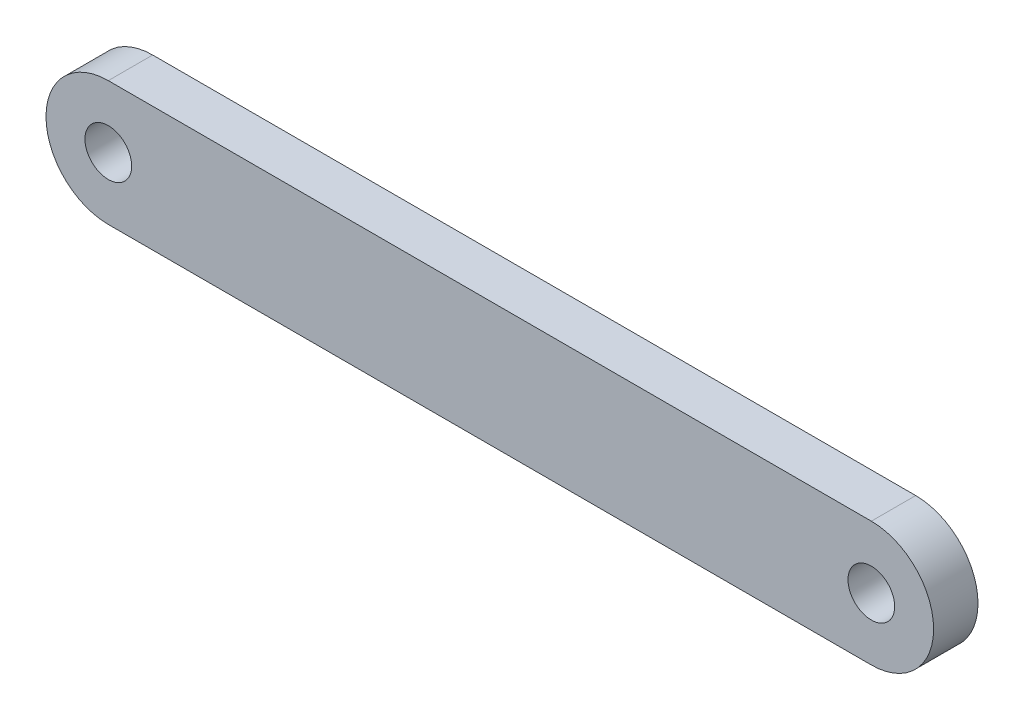
ISO-10303-21;
HEADER;
FILE_DESCRIPTION(('STEP AP214'),'2;1');
FILE_NAME('part.step','',(''),(''),'','','');
FILE_SCHEMA(('AUTOMOTIVE_DESIGN { 1 0 10303 214 1 1 1 1 }'));
ENDSEC;
DATA;
#1=APPLICATION_CONTEXT('core data for automotive mechanical design processes');
#2=APPLICATION_PROTOCOL_DEFINITION('international standard','automotive_design',2000,#1);
#3=PRODUCT_CONTEXT('',#1,'mechanical');
#4=PRODUCT('Part','Part','',(#3));
#5=PRODUCT_RELATED_PRODUCT_CATEGORY('part','',(#4));
#6=PRODUCT_DEFINITION_FORMATION('','',#4);
#7=PRODUCT_DEFINITION_CONTEXT('part definition',#1,'design');
#8=PRODUCT_DEFINITION('design','',#6,#7);
#9=PRODUCT_DEFINITION_SHAPE('','',#8);
#10=(LENGTH_UNIT() NAMED_UNIT(*) SI_UNIT(.MILLI.,.METRE.));
#11=(NAMED_UNIT(*) PLANE_ANGLE_UNIT() SI_UNIT($,.RADIAN.));
#12=(NAMED_UNIT(*) SI_UNIT($,.STERADIAN.) SOLID_ANGLE_UNIT());
#13=UNCERTAINTY_MEASURE_WITH_UNIT(LENGTH_MEASURE(1.E-05),#10,'distance_accuracy_value','');
#14=(GEOMETRIC_REPRESENTATION_CONTEXT(3) GLOBAL_UNCERTAINTY_ASSIGNED_CONTEXT((#13)) GLOBAL_UNIT_ASSIGNED_CONTEXT((#10,
#11,#12)) REPRESENTATION_CONTEXT('',''));
#15=CARTESIAN_POINT('',(0.,0.,0.));
#16=DIRECTION('',(0.,0.,1.));
#17=DIRECTION('',(1.,0.,0.));
#18=AXIS2_PLACEMENT_3D('',#15,#16,#17);
#19=CARTESIAN_POINT('',(0.,0.,2.85));
#20=DIRECTION('',(0.,0.,1.));
#21=DIRECTION('',(1.,0.,0.));
#22=AXIS2_PLACEMENT_3D('',#19,#20,#21);
#23=PLANE('',#22);
#24=DIRECTION('',(-1.,0.,0.));
#25=VECTOR('',#24,1.);
#26=CARTESIAN_POINT('',(-28.5,4.,2.85));
#27=LINE('',#26,#25);
#28=CARTESIAN_POINT('',(24.5,4.,2.85));
#29=VERTEX_POINT('',#28);
#30=CARTESIAN_POINT('',(-24.5,4.,2.85));
#31=VERTEX_POINT('',#30);
#32=EDGE_CURVE('E78',#29,#31,#27,.T.);
#33=ORIENTED_EDGE('',*,*,#32,.T.);
#34=CARTESIAN_POINT('',(-24.5,0.,2.85));
#35=DIRECTION('',(0.,0.,1.));
#36=DIRECTION('',(-1.,0.,0.));
#37=AXIS2_PLACEMENT_3D('',#34,#35,#36);
#38=CIRCLE('',#37,4.);
#39=CARTESIAN_POINT('',(-24.5,-4.,2.85));
#40=VERTEX_POINT('',#39);
#41=EDGE_CURVE('E75',#31,#40,#38,.T.);
#42=ORIENTED_EDGE('',*,*,#41,.T.);
#43=DIRECTION('',(1.,0.,0.));
#44=VECTOR('',#43,1.);
#45=CARTESIAN_POINT('',(-28.5,-4.,2.85));
#46=LINE('',#45,#44);
#47=CARTESIAN_POINT('',(24.5,-4.,2.85));
#48=VERTEX_POINT('',#47);
#49=EDGE_CURVE('E60',#40,#48,#46,.T.);
#50=ORIENTED_EDGE('',*,*,#49,.T.);
#51=CARTESIAN_POINT('',(24.5,0.,2.85));
#52=DIRECTION('',(0.,0.,-1.));
#53=DIRECTION('',(1.,0.,0.));
#54=AXIS2_PLACEMENT_3D('',#51,#52,#53);
#55=CIRCLE('',#54,4.);
#56=EDGE_CURVE('E103',#29,#48,#55,.T.);
#57=ORIENTED_EDGE('',*,*,#56,.F.);
#58=EDGE_LOOP('',(#33,#42,#50,#57));
#59=FACE_BOUND('',#58,.T.);
#60=CARTESIAN_POINT('',(24.5,0.,2.85));
#61=DIRECTION('',(0.,0.,1.));
#62=DIRECTION('',(1.,0.,0.));
#63=AXIS2_PLACEMENT_3D('',#60,#61,#62);
#64=CIRCLE('',#63,1.5);
#65=CARTESIAN_POINT('',(26.,0.,2.85));
#66=VERTEX_POINT('',#65);
#67=EDGE_CURVE('E87',#66,#66,#64,.T.);
#68=ORIENTED_EDGE('',*,*,#67,.F.);
#69=EDGE_LOOP('',(#68));
#70=FACE_BOUND('',#69,.T.);
#71=CARTESIAN_POINT('',(-24.5,0.,2.85));
#72=DIRECTION('',(0.,0.,-1.));
#73=DIRECTION('',(-1.,0.,0.));
#74=AXIS2_PLACEMENT_3D('',#71,#72,#73);
#75=CIRCLE('',#74,1.5);
#76=CARTESIAN_POINT('',(-26.,0.,2.85));
#77=VERTEX_POINT('',#76);
#78=EDGE_CURVE('E117',#77,#77,#75,.T.);
#79=ORIENTED_EDGE('',*,*,#78,.T.);
#80=EDGE_LOOP('',(#79));
#81=FACE_BOUND('',#80,.T.);
#82=ADVANCED_FACE('F32',(#59,#70,#81),#23,.T.);
#83=CARTESIAN_POINT('',(0.,0.,0.));
#84=DIRECTION('',(0.,0.,1.));
#85=DIRECTION('',(1.,0.,0.));
#86=AXIS2_PLACEMENT_3D('',#83,#84,#85);
#87=PLANE('',#86);
#88=CARTESIAN_POINT('',(-24.5,0.,0.));
#89=DIRECTION('',(0.,0.,1.));
#90=DIRECTION('',(1.,0.,0.));
#91=AXIS2_PLACEMENT_3D('',#88,#89,#90);
#92=CIRCLE('',#91,4.);
#93=CARTESIAN_POINT('',(-24.5,4.,0.));
#94=VERTEX_POINT('',#93);
#95=CARTESIAN_POINT('',(-24.5,-4.,0.));
#96=VERTEX_POINT('',#95);
#97=EDGE_CURVE('E11',#94,#96,#92,.T.);
#98=ORIENTED_EDGE('',*,*,#97,.F.);
#99=DIRECTION('',(-1.,0.,0.));
#100=VECTOR('',#99,1.);
#101=CARTESIAN_POINT('',(-28.5,4.,0.));
#102=LINE('',#101,#100);
#103=CARTESIAN_POINT('',(24.5,4.,0.));
#104=VERTEX_POINT('',#103);
#105=EDGE_CURVE('E97',#104,#94,#102,.T.);
#106=ORIENTED_EDGE('',*,*,#105,.F.);
#107=CARTESIAN_POINT('',(24.5,0.,0.));
#108=DIRECTION('',(0.,0.,1.));
#109=DIRECTION('',(1.,0.,0.));
#110=AXIS2_PLACEMENT_3D('',#107,#108,#109);
#111=CIRCLE('',#110,4.);
#112=CARTESIAN_POINT('',(24.5,-4.,0.));
#113=VERTEX_POINT('',#112);
#114=EDGE_CURVE('E41',#104,#113,#111,.F.);
#115=ORIENTED_EDGE('',*,*,#114,.T.);
#116=DIRECTION('',(1.,0.,0.));
#117=VECTOR('',#116,1.);
#118=CARTESIAN_POINT('',(-28.5,-4.,0.));
#119=LINE('',#118,#117);
#120=EDGE_CURVE('E93',#96,#113,#119,.T.);
#121=ORIENTED_EDGE('',*,*,#120,.F.);
#122=EDGE_LOOP('',(#98,#106,#115,#121));
#123=FACE_BOUND('',#122,.T.);
#124=CARTESIAN_POINT('',(24.5,0.,0.));
#125=DIRECTION('',(0.,0.,1.));
#126=DIRECTION('',(1.,0.,0.));
#127=AXIS2_PLACEMENT_3D('',#124,#125,#126);
#128=CIRCLE('',#127,1.5);
#129=CARTESIAN_POINT('',(26.,0.,0.));
#130=VERTEX_POINT('',#129);
#131=EDGE_CURVE('E111',#130,#130,#128,.T.);
#132=ORIENTED_EDGE('',*,*,#131,.T.);
#133=EDGE_LOOP('',(#132));
#134=FACE_BOUND('',#133,.T.);
#135=CARTESIAN_POINT('',(-24.5,0.,0.));
#136=DIRECTION('',(0.,0.,-1.));
#137=DIRECTION('',(-1.,0.,0.));
#138=AXIS2_PLACEMENT_3D('',#135,#136,#137);
#139=CIRCLE('',#138,1.5);
#140=CARTESIAN_POINT('',(-26.,0.,0.));
#141=VERTEX_POINT('',#140);
#142=EDGE_CURVE('E81',#141,#141,#139,.T.);
#143=ORIENTED_EDGE('',*,*,#142,.F.);
#144=EDGE_LOOP('',(#143));
#145=FACE_BOUND('',#144,.T.);
#146=ADVANCED_FACE('F105',(#123,#134,#145),#87,.F.);
#147=CARTESIAN_POINT('',(-28.5,-4.,2.85));
#148=DIRECTION('',(0.,1.,0.));
#149=DIRECTION('',(0.,0.,1.));
#150=AXIS2_PLACEMENT_3D('',#147,#148,#149);
#151=PLANE('',#150);
#152=DIRECTION('',(0.,0.,1.));
#153=VECTOR('',#152,1.);
#154=CARTESIAN_POINT('',(-24.5,-4.,0.));
#155=LINE('',#154,#153);
#156=EDGE_CURVE('E83',#96,#40,#155,.T.);
#157=ORIENTED_EDGE('',*,*,#156,.F.);
#158=ORIENTED_EDGE('',*,*,#120,.T.);
#159=DIRECTION('',(0.,0.,1.));
#160=VECTOR('',#159,1.);
#161=CARTESIAN_POINT('',(24.5,-4.,0.));
#162=LINE('',#161,#160);
#163=EDGE_CURVE('E91',#113,#48,#162,.T.);
#164=ORIENTED_EDGE('',*,*,#163,.T.);
#165=ORIENTED_EDGE('',*,*,#49,.F.);
#166=EDGE_LOOP('',(#157,#158,#164,#165));
#167=FACE_BOUND('',#166,.T.);
#168=ADVANCED_FACE('F90',(#167),#151,.F.);
#169=CARTESIAN_POINT('',(-28.5,4.,2.85));
#170=DIRECTION('',(0.,-1.,0.));
#171=DIRECTION('',(0.,0.,-1.));
#172=AXIS2_PLACEMENT_3D('',#169,#170,#171);
#173=PLANE('',#172);
#174=ORIENTED_EDGE('',*,*,#105,.T.);
#175=DIRECTION('',(0.,0.,1.));
#176=VECTOR('',#175,1.);
#177=CARTESIAN_POINT('',(-24.5,4.,0.));
#178=LINE('',#177,#176);
#179=EDGE_CURVE('E80',#94,#31,#178,.T.);
#180=ORIENTED_EDGE('',*,*,#179,.T.);
#181=ORIENTED_EDGE('',*,*,#32,.F.);
#182=DIRECTION('',(0.,0.,1.));
#183=VECTOR('',#182,1.);
#184=CARTESIAN_POINT('',(24.5,4.,0.));
#185=LINE('',#184,#183);
#186=EDGE_CURVE('E100',#104,#29,#185,.T.);
#187=ORIENTED_EDGE('',*,*,#186,.F.);
#188=EDGE_LOOP('',(#174,#180,#181,#187));
#189=FACE_BOUND('',#188,.T.);
#190=ADVANCED_FACE('F34',(#189),#173,.F.);
#191=CARTESIAN_POINT('',(24.5,0.,0.));
#192=DIRECTION('',(0.,0.,1.));
#193=DIRECTION('',(1.,0.,0.));
#194=AXIS2_PLACEMENT_3D('',#191,#192,#193);
#195=CYLINDRICAL_SURFACE('',#194,4.);
#196=ORIENTED_EDGE('',*,*,#56,.T.);
#197=ORIENTED_EDGE('',*,*,#163,.F.);
#198=ORIENTED_EDGE('',*,*,#114,.F.);
#199=ORIENTED_EDGE('',*,*,#186,.T.);
#200=EDGE_LOOP('',(#196,#197,#198,#199));
#201=FACE_BOUND('',#200,.T.);
#202=ADVANCED_FACE('F102',(#201),#195,.T.);
#203=CARTESIAN_POINT('',(24.5,0.,0.));
#204=DIRECTION('',(0.,0.,1.));
#205=DIRECTION('',(1.,0.,0.));
#206=AXIS2_PLACEMENT_3D('',#203,#204,#205);
#207=CYLINDRICAL_SURFACE('',#206,1.5);
#208=ORIENTED_EDGE('',*,*,#131,.F.);
#209=EDGE_LOOP('',(#208));
#210=FACE_BOUND('',#209,.T.);
#211=ORIENTED_EDGE('',*,*,#67,.T.);
#212=EDGE_LOOP('',(#211));
#213=FACE_BOUND('',#212,.T.);
#214=ADVANCED_FACE('F136',(#210,#213),#207,.F.);
#215=CARTESIAN_POINT('',(-24.5,0.,0.));
#216=DIRECTION('',(0.,0.,1.));
#217=DIRECTION('',(1.,0.,0.));
#218=AXIS2_PLACEMENT_3D('',#215,#216,#217);
#219=CYLINDRICAL_SURFACE('',#218,4.);
#220=ORIENTED_EDGE('',*,*,#179,.F.);
#221=ORIENTED_EDGE('',*,*,#97,.T.);
#222=ORIENTED_EDGE('',*,*,#156,.T.);
#223=ORIENTED_EDGE('',*,*,#41,.F.);
#224=EDGE_LOOP('',(#220,#221,#222,#223));
#225=FACE_BOUND('',#224,.T.);
#226=ADVANCED_FACE('F84',(#225),#219,.T.);
#227=CARTESIAN_POINT('',(-24.5,0.,0.));
#228=DIRECTION('',(0.,0.,1.));
#229=DIRECTION('',(1.,0.,0.));
#230=AXIS2_PLACEMENT_3D('',#227,#228,#229);
#231=CYLINDRICAL_SURFACE('',#230,1.5);
#232=ORIENTED_EDGE('',*,*,#142,.T.);
#233=EDGE_LOOP('',(#232));
#234=FACE_BOUND('',#233,.T.);
#235=ORIENTED_EDGE('',*,*,#78,.F.);
#236=EDGE_LOOP('',(#235));
#237=FACE_BOUND('',#236,.T.);
#238=ADVANCED_FACE('F123',(#234,#237),#231,.F.);
#239=CLOSED_SHELL('',(#82,#146,#168,#190,#202,#214,#226,#238));
#240=MANIFOLD_SOLID_BREP('B2',#239);
#241=ADVANCED_BREP_SHAPE_REPRESENTATION('',(#18,#240),#14);
#242=SHAPE_DEFINITION_REPRESENTATION(#9,#241);
ENDSEC;
END-ISO-10303-21;
